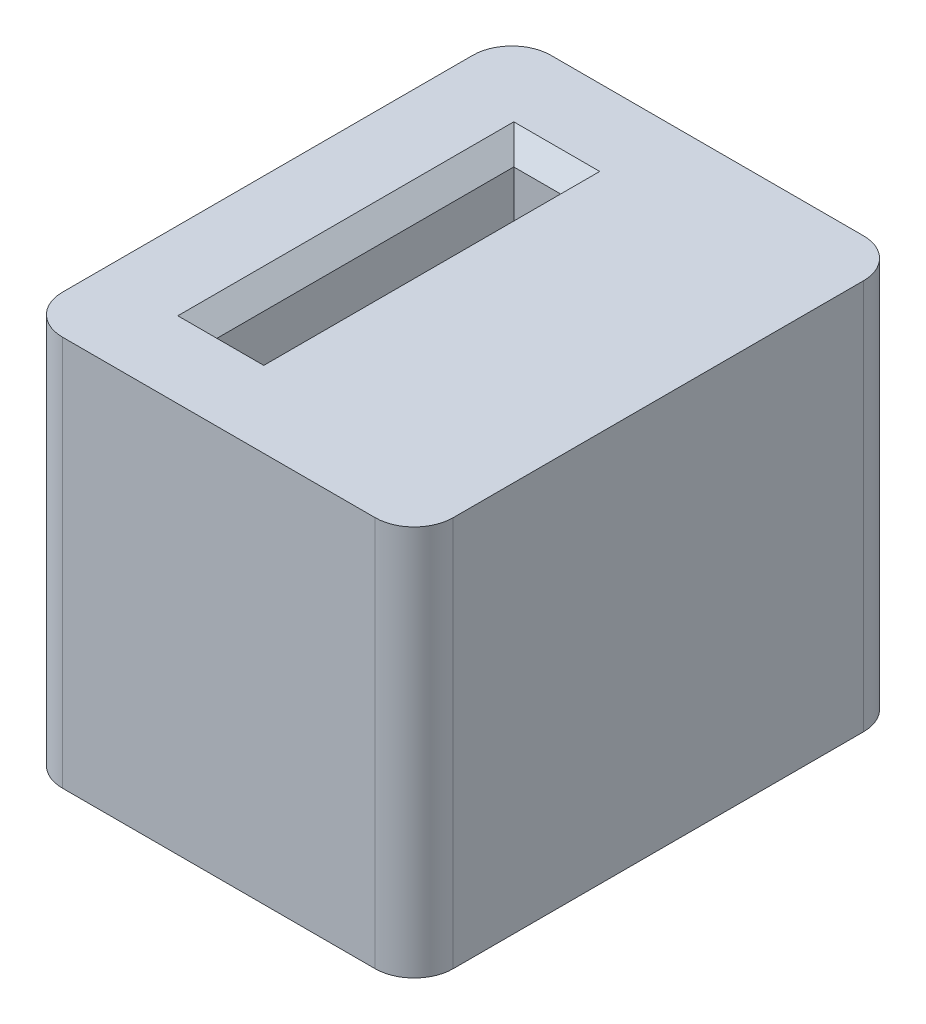
ISO-10303-21;
HEADER;
FILE_DESCRIPTION(('STEP AP214'),'2;1');
FILE_NAME('part.step','',(''),(''),'','','');
FILE_SCHEMA(('AUTOMOTIVE_DESIGN { 1 0 10303 214 1 1 1 1 }'));
ENDSEC;
DATA;
#1=APPLICATION_CONTEXT('core data for automotive mechanical design processes');
#2=APPLICATION_PROTOCOL_DEFINITION('international standard','automotive_design',2000,#1);
#3=PRODUCT_CONTEXT('',#1,'mechanical');
#4=PRODUCT('Part','Part','',(#3));
#5=PRODUCT_RELATED_PRODUCT_CATEGORY('part','',(#4));
#6=PRODUCT_DEFINITION_FORMATION('','',#4);
#7=PRODUCT_DEFINITION_CONTEXT('part definition',#1,'design');
#8=PRODUCT_DEFINITION('design','',#6,#7);
#9=PRODUCT_DEFINITION_SHAPE('','',#8);
#10=(LENGTH_UNIT() NAMED_UNIT(*) SI_UNIT(.MILLI.,.METRE.));
#11=(NAMED_UNIT(*) PLANE_ANGLE_UNIT() SI_UNIT($,.RADIAN.));
#12=(NAMED_UNIT(*) SI_UNIT($,.STERADIAN.) SOLID_ANGLE_UNIT());
#13=UNCERTAINTY_MEASURE_WITH_UNIT(LENGTH_MEASURE(1.E-05),#10,'distance_accuracy_value','');
#14=(GEOMETRIC_REPRESENTATION_CONTEXT(3) GLOBAL_UNCERTAINTY_ASSIGNED_CONTEXT((#13)) GLOBAL_UNIT_ASSIGNED_CONTEXT((#10,
#11,#12)) REPRESENTATION_CONTEXT('',''));
#15=CARTESIAN_POINT('',(0.,0.,0.));
#16=DIRECTION('',(0.,0.,1.));
#17=DIRECTION('',(1.,0.,0.));
#18=AXIS2_PLACEMENT_3D('',#15,#16,#17);
#19=CARTESIAN_POINT('',(12.7,25.4,-15.875));
#20=DIRECTION('',(-1.,0.,0.));
#21=DIRECTION('',(0.,0.,1.));
#22=AXIS2_PLACEMENT_3D('',#19,#20,#21);
#23=PLANE('',#22);
#24=DIRECTION('',(0.,0.,-1.));
#25=VECTOR('',#24,1.);
#26=CARTESIAN_POINT('',(12.7,0.,-15.875));
#27=LINE('',#26,#25);
#28=CARTESIAN_POINT('',(12.7,0.,13.335));
#29=VERTEX_POINT('',#28);
#30=CARTESIAN_POINT('',(12.7,0.,-13.335));
#31=VERTEX_POINT('',#30);
#32=EDGE_CURVE('E185',#29,#31,#27,.T.);
#33=ORIENTED_EDGE('',*,*,#32,.T.);
#34=DIRECTION('',(0.,-1.,0.));
#35=VECTOR('',#34,1.);
#36=CARTESIAN_POINT('',(12.7,25.4,-13.335));
#37=LINE('',#36,#35);
#38=CARTESIAN_POINT('',(12.7,25.4,-13.335));
#39=VERTEX_POINT('',#38);
#40=EDGE_CURVE('E160',#31,#39,#37,.F.);
#41=ORIENTED_EDGE('',*,*,#40,.T.);
#42=DIRECTION('',(0.,0.,-1.));
#43=VECTOR('',#42,1.);
#44=CARTESIAN_POINT('',(12.7,25.4,-15.875));
#45=LINE('',#44,#43);
#46=CARTESIAN_POINT('',(12.7,25.4,13.335));
#47=VERTEX_POINT('',#46);
#48=EDGE_CURVE('E199',#47,#39,#45,.T.);
#49=ORIENTED_EDGE('',*,*,#48,.F.);
#50=DIRECTION('',(0.,-1.,0.));
#51=VECTOR('',#50,1.);
#52=CARTESIAN_POINT('',(12.7,25.4,13.335));
#53=LINE('',#52,#51);
#54=EDGE_CURVE('E166',#47,#29,#53,.T.);
#55=ORIENTED_EDGE('',*,*,#54,.T.);
#56=EDGE_LOOP('',(#33,#41,#49,#55));
#57=FACE_BOUND('',#56,.T.);
#58=ADVANCED_FACE('F40',(#57),#23,.F.);
#59=CARTESIAN_POINT('',(-12.7,25.4,-15.875));
#60=DIRECTION('',(0.,0.,1.));
#61=DIRECTION('',(1.,0.,0.));
#62=AXIS2_PLACEMENT_3D('',#59,#60,#61);
#63=PLANE('',#62);
#64=DIRECTION('',(-1.,0.,0.));
#65=VECTOR('',#64,1.);
#66=CARTESIAN_POINT('',(-12.7,25.4,-15.875));
#67=LINE('',#66,#65);
#68=CARTESIAN_POINT('',(10.16,25.4,-15.875));
#69=VERTEX_POINT('',#68);
#70=CARTESIAN_POINT('',(-10.16,25.4,-15.875));
#71=VERTEX_POINT('',#70);
#72=EDGE_CURVE('E176',#69,#71,#67,.T.);
#73=ORIENTED_EDGE('',*,*,#72,.F.);
#74=DIRECTION('',(0.,-1.,0.));
#75=VECTOR('',#74,1.);
#76=CARTESIAN_POINT('',(10.16,25.4,-15.875));
#77=LINE('',#76,#75);
#78=CARTESIAN_POINT('',(10.16,0.,-15.875));
#79=VERTEX_POINT('',#78);
#80=EDGE_CURVE('E159',#69,#79,#77,.T.);
#81=ORIENTED_EDGE('',*,*,#80,.T.);
#82=DIRECTION('',(-1.,0.,0.));
#83=VECTOR('',#82,1.);
#84=CARTESIAN_POINT('',(-12.7,0.,-15.875));
#85=LINE('',#84,#83);
#86=CARTESIAN_POINT('',(-10.16,0.,-15.875));
#87=VERTEX_POINT('',#86);
#88=EDGE_CURVE('E173',#79,#87,#85,.T.);
#89=ORIENTED_EDGE('',*,*,#88,.T.);
#90=DIRECTION('',(0.,-1.,0.));
#91=VECTOR('',#90,1.);
#92=CARTESIAN_POINT('',(-10.16,25.4,-15.875));
#93=LINE('',#92,#91);
#94=EDGE_CURVE('E179',#87,#71,#93,.F.);
#95=ORIENTED_EDGE('',*,*,#94,.T.);
#96=EDGE_LOOP('',(#73,#81,#89,#95));
#97=FACE_BOUND('',#96,.T.);
#98=ADVANCED_FACE('F172',(#97),#63,.F.);
#99=CARTESIAN_POINT('',(-12.7,25.4,-15.875));
#100=DIRECTION('',(1.,0.,0.));
#101=DIRECTION('',(0.,0.,-1.));
#102=AXIS2_PLACEMENT_3D('',#99,#100,#101);
#103=PLANE('',#102);
#104=DIRECTION('',(0.,0.,1.));
#105=VECTOR('',#104,1.);
#106=CARTESIAN_POINT('',(-12.7,0.,-15.875));
#107=LINE('',#106,#105);
#108=CARTESIAN_POINT('',(-12.7,0.,-13.335));
#109=VERTEX_POINT('',#108);
#110=CARTESIAN_POINT('',(-12.7,0.,13.335));
#111=VERTEX_POINT('',#110);
#112=EDGE_CURVE('E184',#109,#111,#107,.T.);
#113=ORIENTED_EDGE('',*,*,#112,.T.);
#114=DIRECTION('',(0.,-1.,0.));
#115=VECTOR('',#114,1.);
#116=CARTESIAN_POINT('',(-12.7,25.4,13.335));
#117=LINE('',#116,#115);
#118=CARTESIAN_POINT('',(-12.7,25.4,13.335));
#119=VERTEX_POINT('',#118);
#120=EDGE_CURVE('E238',#111,#119,#117,.F.);
#121=ORIENTED_EDGE('',*,*,#120,.T.);
#122=DIRECTION('',(0.,0.,1.));
#123=VECTOR('',#122,1.);
#124=CARTESIAN_POINT('',(-12.7,25.4,-15.875));
#125=LINE('',#124,#123);
#126=CARTESIAN_POINT('',(-12.7,25.4,-13.335));
#127=VERTEX_POINT('',#126);
#128=EDGE_CURVE('E341',#127,#119,#125,.T.);
#129=ORIENTED_EDGE('',*,*,#128,.F.);
#130=DIRECTION('',(0.,-1.,0.));
#131=VECTOR('',#130,1.);
#132=CARTESIAN_POINT('',(-12.7,25.4,-13.335));
#133=LINE('',#132,#131);
#134=EDGE_CURVE('E234',#127,#109,#133,.T.);
#135=ORIENTED_EDGE('',*,*,#134,.T.);
#136=EDGE_LOOP('',(#113,#121,#129,#135));
#137=FACE_BOUND('',#136,.T.);
#138=ADVANCED_FACE('F361',(#137),#103,.F.);
#139=CARTESIAN_POINT('',(-12.7,25.4,15.875));
#140=DIRECTION('',(0.,0.,-1.));
#141=DIRECTION('',(-1.,0.,0.));
#142=AXIS2_PLACEMENT_3D('',#139,#140,#141);
#143=PLANE('',#142);
#144=DIRECTION('',(1.,0.,0.));
#145=VECTOR('',#144,1.);
#146=CARTESIAN_POINT('',(-12.7,25.4,15.875));
#147=LINE('',#146,#145);
#148=CARTESIAN_POINT('',(-10.16,25.4,15.875));
#149=VERTEX_POINT('',#148);
#150=CARTESIAN_POINT('',(10.16,25.4,15.875));
#151=VERTEX_POINT('',#150);
#152=EDGE_CURVE('E201',#149,#151,#147,.T.);
#153=ORIENTED_EDGE('',*,*,#152,.F.);
#154=DIRECTION('',(0.,-1.,0.));
#155=VECTOR('',#154,1.);
#156=CARTESIAN_POINT('',(-10.16,25.4,15.875));
#157=LINE('',#156,#155);
#158=CARTESIAN_POINT('',(-10.16,0.,15.875));
#159=VERTEX_POINT('',#158);
#160=EDGE_CURVE('E230',#149,#159,#157,.T.);
#161=ORIENTED_EDGE('',*,*,#160,.T.);
#162=DIRECTION('',(1.,0.,0.));
#163=VECTOR('',#162,1.);
#164=CARTESIAN_POINT('',(-12.7,0.,15.875));
#165=LINE('',#164,#163);
#166=CARTESIAN_POINT('',(10.16,0.,15.875));
#167=VERTEX_POINT('',#166);
#168=EDGE_CURVE('E190',#159,#167,#165,.T.);
#169=ORIENTED_EDGE('',*,*,#168,.T.);
#170=DIRECTION('',(0.,-1.,0.));
#171=VECTOR('',#170,1.);
#172=CARTESIAN_POINT('',(10.16,25.4,15.875));
#173=LINE('',#172,#171);
#174=EDGE_CURVE('E227',#167,#151,#173,.F.);
#175=ORIENTED_EDGE('',*,*,#174,.T.);
#176=EDGE_LOOP('',(#153,#161,#169,#175));
#177=FACE_BOUND('',#176,.T.);
#178=ADVANCED_FACE('F330',(#177),#143,.F.);
#179=CARTESIAN_POINT('',(0.,25.4,0.));
#180=DIRECTION('',(0.,1.,0.));
#181=DIRECTION('',(0.,0.,1.));
#182=AXIS2_PLACEMENT_3D('',#179,#180,#181);
#183=PLANE('',#182);
#184=DIRECTION('',(0.,0.,1.));
#185=VECTOR('',#184,1.);
#186=CARTESIAN_POINT('',(-2.03199999999999,25.4,9.652));
#187=LINE('',#186,#185);
#188=CARTESIAN_POINT('',(-2.03199999999999,25.4,-10.922));
#189=VERTEX_POINT('',#188);
#190=CARTESIAN_POINT('',(-2.03199999999999,25.4,10.922));
#191=VERTEX_POINT('',#190);
#192=EDGE_CURVE('E51',#189,#191,#187,.T.);
#193=ORIENTED_EDGE('',*,*,#192,.T.);
#194=DIRECTION('',(-1.,0.,0.));
#195=VECTOR('',#194,1.);
#196=CARTESIAN_POINT('',(-6.35,25.4,10.922));
#197=LINE('',#196,#195);
#198=CARTESIAN_POINT('',(-7.62,25.4,10.922));
#199=VERTEX_POINT('',#198);
#200=EDGE_CURVE('E11',#191,#199,#197,.T.);
#201=ORIENTED_EDGE('',*,*,#200,.T.);
#202=DIRECTION('',(0.,0.,-1.));
#203=VECTOR('',#202,1.);
#204=CARTESIAN_POINT('',(-7.62,25.4,-9.652));
#205=LINE('',#204,#203);
#206=CARTESIAN_POINT('',(-7.62,25.4,-10.922));
#207=VERTEX_POINT('',#206);
#208=EDGE_CURVE('E280',#199,#207,#205,.T.);
#209=ORIENTED_EDGE('',*,*,#208,.T.);
#210=DIRECTION('',(1.,0.,0.));
#211=VECTOR('',#210,1.);
#212=CARTESIAN_POINT('',(-3.302,25.4,-10.922));
#213=LINE('',#212,#211);
#214=EDGE_CURVE('E62',#207,#189,#213,.T.);
#215=ORIENTED_EDGE('',*,*,#214,.T.);
#216=EDGE_LOOP('',(#193,#201,#209,#215));
#217=FACE_BOUND('',#216,.T.);
#218=ORIENTED_EDGE('',*,*,#48,.T.);
#219=CARTESIAN_POINT('',(10.16,25.4,-13.335));
#220=DIRECTION('',(0.,1.,0.));
#221=DIRECTION('',(0.,0.,1.));
#222=AXIS2_PLACEMENT_3D('',#219,#220,#221);
#223=CIRCLE('',#222,2.54);
#224=EDGE_CURVE('E224',#39,#69,#223,.T.);
#225=ORIENTED_EDGE('',*,*,#224,.T.);
#226=ORIENTED_EDGE('',*,*,#72,.T.);
#227=CARTESIAN_POINT('',(-10.16,25.4,-13.335));
#228=DIRECTION('',(0.,1.,0.));
#229=DIRECTION('',(0.,0.,1.));
#230=AXIS2_PLACEMENT_3D('',#227,#228,#229);
#231=CIRCLE('',#230,2.54);
#232=EDGE_CURVE('E215',#71,#127,#231,.T.);
#233=ORIENTED_EDGE('',*,*,#232,.T.);
#234=ORIENTED_EDGE('',*,*,#128,.T.);
#235=CARTESIAN_POINT('',(-10.16,25.4,13.335));
#236=DIRECTION('',(0.,1.,0.));
#237=DIRECTION('',(0.,0.,1.));
#238=AXIS2_PLACEMENT_3D('',#235,#236,#237);
#239=CIRCLE('',#238,2.54);
#240=EDGE_CURVE('E221',#119,#149,#239,.T.);
#241=ORIENTED_EDGE('',*,*,#240,.T.);
#242=ORIENTED_EDGE('',*,*,#152,.T.);
#243=CARTESIAN_POINT('',(10.16,25.4,13.335));
#244=DIRECTION('',(0.,1.,0.));
#245=DIRECTION('',(0.,0.,1.));
#246=AXIS2_PLACEMENT_3D('',#243,#244,#245);
#247=CIRCLE('',#246,2.54);
#248=EDGE_CURVE('E218',#151,#47,#247,.T.);
#249=ORIENTED_EDGE('',*,*,#248,.T.);
#250=EDGE_LOOP('',(#218,#225,#226,#233,#234,#241,#242,#249));
#251=FACE_BOUND('',#250,.T.);
#252=ADVANCED_FACE('F327',(#217,#251),#183,.T.);
#253=CARTESIAN_POINT('',(0.,0.,0.));
#254=DIRECTION('',(0.,1.,0.));
#255=DIRECTION('',(0.,0.,1.));
#256=AXIS2_PLACEMENT_3D('',#253,#254,#255);
#257=PLANE('',#256);
#258=DIRECTION('',(0.,0.,1.));
#259=VECTOR('',#258,1.);
#260=CARTESIAN_POINT('',(-7.61999999999999,0.,0.));
#261=LINE('',#260,#259);
#262=CARTESIAN_POINT('',(-7.61999999999999,0.,-10.922));
#263=VERTEX_POINT('',#262);
#264=CARTESIAN_POINT('',(-7.61999999999999,0.,10.922));
#265=VERTEX_POINT('',#264);
#266=EDGE_CURVE('E241',#263,#265,#261,.T.);
#267=ORIENTED_EDGE('',*,*,#266,.T.);
#268=DIRECTION('',(1.,0.,0.));
#269=VECTOR('',#268,1.);
#270=CARTESIAN_POINT('',(0.,0.,10.922));
#271=LINE('',#270,#269);
#272=CARTESIAN_POINT('',(-2.032,0.,10.922));
#273=VERTEX_POINT('',#272);
#274=EDGE_CURVE('E250',#265,#273,#271,.T.);
#275=ORIENTED_EDGE('',*,*,#274,.T.);
#276=DIRECTION('',(0.,0.,-1.));
#277=VECTOR('',#276,1.);
#278=CARTESIAN_POINT('',(-2.032,0.,0.));
#279=LINE('',#278,#277);
#280=CARTESIAN_POINT('',(-2.032,0.,-10.922));
#281=VERTEX_POINT('',#280);
#282=EDGE_CURVE('E247',#273,#281,#279,.T.);
#283=ORIENTED_EDGE('',*,*,#282,.T.);
#284=DIRECTION('',(-1.,0.,0.));
#285=VECTOR('',#284,1.);
#286=CARTESIAN_POINT('',(0.,0.,-10.922));
#287=LINE('',#286,#285);
#288=EDGE_CURVE('E244',#281,#263,#287,.T.);
#289=ORIENTED_EDGE('',*,*,#288,.T.);
#290=EDGE_LOOP('',(#267,#275,#283,#289));
#291=FACE_BOUND('',#290,.T.);
#292=ORIENTED_EDGE('',*,*,#88,.F.);
#293=CARTESIAN_POINT('',(10.16,0.,-13.335));
#294=DIRECTION('',(0.,1.,0.));
#295=DIRECTION('',(0.,0.,1.));
#296=AXIS2_PLACEMENT_3D('',#293,#294,#295);
#297=CIRCLE('',#296,2.54);
#298=EDGE_CURVE('E155',#79,#31,#297,.F.);
#299=ORIENTED_EDGE('',*,*,#298,.T.);
#300=ORIENTED_EDGE('',*,*,#32,.F.);
#301=CARTESIAN_POINT('',(10.16,0.,13.335));
#302=DIRECTION('',(0.,1.,0.));
#303=DIRECTION('',(0.,0.,1.));
#304=AXIS2_PLACEMENT_3D('',#301,#302,#303);
#305=CIRCLE('',#304,2.54);
#306=EDGE_CURVE('E205',#29,#167,#305,.F.);
#307=ORIENTED_EDGE('',*,*,#306,.T.);
#308=ORIENTED_EDGE('',*,*,#168,.F.);
#309=CARTESIAN_POINT('',(-10.16,0.,13.335));
#310=DIRECTION('',(0.,1.,0.));
#311=DIRECTION('',(0.,0.,1.));
#312=AXIS2_PLACEMENT_3D('',#309,#310,#311);
#313=CIRCLE('',#312,2.54);
#314=EDGE_CURVE('E167',#159,#111,#313,.F.);
#315=ORIENTED_EDGE('',*,*,#314,.T.);
#316=ORIENTED_EDGE('',*,*,#112,.F.);
#317=CARTESIAN_POINT('',(-10.16,0.,-13.335));
#318=DIRECTION('',(0.,1.,0.));
#319=DIRECTION('',(0.,0.,1.));
#320=AXIS2_PLACEMENT_3D('',#317,#318,#319);
#321=CIRCLE('',#320,2.54);
#322=EDGE_CURVE('E178',#109,#87,#321,.F.);
#323=ORIENTED_EDGE('',*,*,#322,.T.);
#324=EDGE_LOOP('',(#292,#299,#300,#307,#308,#315,#316,#323));
#325=FACE_BOUND('',#324,.T.);
#326=ADVANCED_FACE('F181',(#291,#325),#257,.F.);
#327=CARTESIAN_POINT('',(-3.302,0.,-9.652));
#328=DIRECTION('',(1.,0.,0.));
#329=DIRECTION('',(0.,0.,-1.));
#330=AXIS2_PLACEMENT_3D('',#327,#328,#329);
#331=PLANE('',#330);
#332=DIRECTION('',(0.,1.,0.));
#333=VECTOR('',#332,1.);
#334=CARTESIAN_POINT('',(-3.302,0.,-9.652));
#335=LINE('',#334,#333);
#336=CARTESIAN_POINT('',(-3.302,1.27,-9.652));
#337=VERTEX_POINT('',#336);
#338=CARTESIAN_POINT('',(-3.302,24.13,-9.652));
#339=VERTEX_POINT('',#338);
#340=EDGE_CURVE('E301',#337,#339,#335,.T.);
#341=ORIENTED_EDGE('',*,*,#340,.F.);
#342=DIRECTION('',(0.,0.,1.));
#343=VECTOR('',#342,1.);
#344=CARTESIAN_POINT('',(-3.302,1.27,-9.652));
#345=LINE('',#344,#343);
#346=CARTESIAN_POINT('',(-3.302,1.27,9.652));
#347=VERTEX_POINT('',#346);
#348=EDGE_CURVE('E265',#337,#347,#345,.T.);
#349=ORIENTED_EDGE('',*,*,#348,.T.);
#350=DIRECTION('',(0.,1.,0.));
#351=VECTOR('',#350,1.);
#352=CARTESIAN_POINT('',(-3.302,0.,9.652));
#353=LINE('',#352,#351);
#354=CARTESIAN_POINT('',(-3.302,24.13,9.652));
#355=VERTEX_POINT('',#354);
#356=EDGE_CURVE('E192',#347,#355,#353,.T.);
#357=ORIENTED_EDGE('',*,*,#356,.T.);
#358=DIRECTION('',(0.,0.,-1.));
#359=VECTOR('',#358,1.);
#360=CARTESIAN_POINT('',(-3.302,24.13,-9.652));
#361=LINE('',#360,#359);
#362=EDGE_CURVE('E262',#355,#339,#361,.T.);
#363=ORIENTED_EDGE('',*,*,#362,.T.);
#364=EDGE_LOOP('',(#341,#349,#357,#363));
#365=FACE_BOUND('',#364,.T.);
#366=ADVANCED_FACE('F418',(#365),#331,.F.);
#367=CARTESIAN_POINT('',(-6.35,0.,9.652));
#368=DIRECTION('',(0.,0.,1.));
#369=DIRECTION('',(1.,0.,0.));
#370=AXIS2_PLACEMENT_3D('',#367,#368,#369);
#371=PLANE('',#370);
#372=ORIENTED_EDGE('',*,*,#356,.F.);
#373=DIRECTION('',(-1.,0.,0.));
#374=VECTOR('',#373,1.);
#375=CARTESIAN_POINT('',(-6.35,1.27,9.652));
#376=LINE('',#375,#374);
#377=CARTESIAN_POINT('',(-6.35,1.27,9.652));
#378=VERTEX_POINT('',#377);
#379=EDGE_CURVE('E258',#347,#378,#376,.T.);
#380=ORIENTED_EDGE('',*,*,#379,.T.);
#381=DIRECTION('',(0.,1.,0.));
#382=VECTOR('',#381,1.);
#383=CARTESIAN_POINT('',(-6.35,0.,9.652));
#384=LINE('',#383,#382);
#385=CARTESIAN_POINT('',(-6.35,24.13,9.652));
#386=VERTEX_POINT('',#385);
#387=EDGE_CURVE('E549',#378,#386,#384,.T.);
#388=ORIENTED_EDGE('',*,*,#387,.T.);
#389=DIRECTION('',(1.,0.,0.));
#390=VECTOR('',#389,1.);
#391=CARTESIAN_POINT('',(-3.302,24.13,9.652));
#392=LINE('',#391,#390);
#393=EDGE_CURVE('E254',#386,#355,#392,.T.);
#394=ORIENTED_EDGE('',*,*,#393,.T.);
#395=EDGE_LOOP('',(#372,#380,#388,#394));
#396=FACE_BOUND('',#395,.T.);
#397=ADVANCED_FACE('F426',(#396),#371,.F.);
#398=CARTESIAN_POINT('',(-6.35,0.,-9.652));
#399=DIRECTION('',(-1.,0.,0.));
#400=DIRECTION('',(0.,0.,1.));
#401=AXIS2_PLACEMENT_3D('',#398,#399,#400);
#402=PLANE('',#401);
#403=ORIENTED_EDGE('',*,*,#387,.F.);
#404=DIRECTION('',(0.,0.,-1.));
#405=VECTOR('',#404,1.);
#406=CARTESIAN_POINT('',(-6.35,1.27,-9.652));
#407=LINE('',#406,#405);
#408=CARTESIAN_POINT('',(-6.35,1.27,-9.652));
#409=VERTEX_POINT('',#408);
#410=EDGE_CURVE('E277',#378,#409,#407,.T.);
#411=ORIENTED_EDGE('',*,*,#410,.T.);
#412=DIRECTION('',(0.,1.,0.));
#413=VECTOR('',#412,1.);
#414=CARTESIAN_POINT('',(-6.35,0.,-9.652));
#415=LINE('',#414,#413);
#416=CARTESIAN_POINT('',(-6.35,24.13,-9.652));
#417=VERTEX_POINT('',#416);
#418=EDGE_CURVE('E552',#409,#417,#415,.T.);
#419=ORIENTED_EDGE('',*,*,#418,.T.);
#420=DIRECTION('',(0.,0.,1.));
#421=VECTOR('',#420,1.);
#422=CARTESIAN_POINT('',(-6.35,24.13,9.652));
#423=LINE('',#422,#421);
#424=EDGE_CURVE('E274',#417,#386,#423,.T.);
#425=ORIENTED_EDGE('',*,*,#424,.T.);
#426=EDGE_LOOP('',(#403,#411,#419,#425));
#427=FACE_BOUND('',#426,.T.);
#428=ADVANCED_FACE('F434',(#427),#402,.F.);
#429=CARTESIAN_POINT('',(-6.35,0.,-9.652));
#430=DIRECTION('',(0.,0.,-1.));
#431=DIRECTION('',(-1.,0.,0.));
#432=AXIS2_PLACEMENT_3D('',#429,#430,#431);
#433=PLANE('',#432);
#434=ORIENTED_EDGE('',*,*,#418,.F.);
#435=DIRECTION('',(1.,0.,0.));
#436=VECTOR('',#435,1.);
#437=CARTESIAN_POINT('',(-6.35,1.27,-9.652));
#438=LINE('',#437,#436);
#439=EDGE_CURVE('E271',#409,#337,#438,.T.);
#440=ORIENTED_EDGE('',*,*,#439,.T.);
#441=ORIENTED_EDGE('',*,*,#340,.T.);
#442=DIRECTION('',(-1.,0.,0.));
#443=VECTOR('',#442,1.);
#444=CARTESIAN_POINT('',(-6.35,24.13,-9.652));
#445=LINE('',#444,#443);
#446=EDGE_CURVE('E268',#339,#417,#445,.T.);
#447=ORIENTED_EDGE('',*,*,#446,.T.);
#448=EDGE_LOOP('',(#434,#440,#441,#447));
#449=FACE_BOUND('',#448,.T.);
#450=ADVANCED_FACE('F389',(#449),#433,.F.);
#451=CARTESIAN_POINT('',(10.16,25.4,-13.335));
#452=DIRECTION('',(0.,-1.,0.));
#453=DIRECTION('',(0.,0.,-1.));
#454=AXIS2_PLACEMENT_3D('',#451,#452,#453);
#455=CYLINDRICAL_SURFACE('',#454,2.54);
#456=ORIENTED_EDGE('',*,*,#224,.F.);
#457=ORIENTED_EDGE('',*,*,#40,.F.);
#458=ORIENTED_EDGE('',*,*,#298,.F.);
#459=ORIENTED_EDGE('',*,*,#80,.F.);
#460=EDGE_LOOP('',(#456,#457,#458,#459));
#461=FACE_BOUND('',#460,.T.);
#462=ADVANCED_FACE('F158',(#461),#455,.T.);
#463=CARTESIAN_POINT('',(-10.16,25.4,13.335));
#464=DIRECTION('',(0.,-1.,0.));
#465=DIRECTION('',(0.,0.,-1.));
#466=AXIS2_PLACEMENT_3D('',#463,#464,#465);
#467=CYLINDRICAL_SURFACE('',#466,2.54);
#468=ORIENTED_EDGE('',*,*,#240,.F.);
#469=ORIENTED_EDGE('',*,*,#120,.F.);
#470=ORIENTED_EDGE('',*,*,#314,.F.);
#471=ORIENTED_EDGE('',*,*,#160,.F.);
#472=EDGE_LOOP('',(#468,#469,#470,#471));
#473=FACE_BOUND('',#472,.T.);
#474=ADVANCED_FACE('F358',(#473),#467,.T.);
#475=CARTESIAN_POINT('',(10.16,25.4,13.335));
#476=DIRECTION('',(0.,-1.,0.));
#477=DIRECTION('',(0.,0.,-1.));
#478=AXIS2_PLACEMENT_3D('',#475,#476,#477);
#479=CYLINDRICAL_SURFACE('',#478,2.54);
#480=ORIENTED_EDGE('',*,*,#248,.F.);
#481=ORIENTED_EDGE('',*,*,#174,.F.);
#482=ORIENTED_EDGE('',*,*,#306,.F.);
#483=ORIENTED_EDGE('',*,*,#54,.F.);
#484=EDGE_LOOP('',(#480,#481,#482,#483));
#485=FACE_BOUND('',#484,.T.);
#486=ADVANCED_FACE('F355',(#485),#479,.T.);
#487=CARTESIAN_POINT('',(-10.16,25.4,-13.335));
#488=DIRECTION('',(0.,-1.,0.));
#489=DIRECTION('',(0.,0.,-1.));
#490=AXIS2_PLACEMENT_3D('',#487,#488,#489);
#491=CYLINDRICAL_SURFACE('',#490,2.54);
#492=ORIENTED_EDGE('',*,*,#232,.F.);
#493=ORIENTED_EDGE('',*,*,#94,.F.);
#494=ORIENTED_EDGE('',*,*,#322,.F.);
#495=ORIENTED_EDGE('',*,*,#134,.F.);
#496=EDGE_LOOP('',(#492,#493,#494,#495));
#497=FACE_BOUND('',#496,.T.);
#498=ADVANCED_FACE('F366',(#497),#491,.T.);
#499=CARTESIAN_POINT('',(0.,0.,-10.922));
#500=DIRECTION('',(0.,0.707106781186546,-0.707106781186549));
#501=DIRECTION('',(-1.,0.,0.));
#502=AXIS2_PLACEMENT_3D('',#499,#500,#501);
#503=PLANE('',#502);
#504=DIRECTION('',(-0.577350269189625,0.577350269189628,0.577350269189625));
#505=VECTOR('',#504,1.);
#506=CARTESIAN_POINT('',(-5.67266666666666,3.64066666666667,-7.28133333333334));
#507=LINE('',#506,#505);
#508=EDGE_CURVE('E293',#337,#281,#507,.F.);
#509=ORIENTED_EDGE('',*,*,#508,.F.);
#510=ORIENTED_EDGE('',*,*,#439,.F.);
#511=DIRECTION('',(0.577350269189625,0.577350269189628,0.577350269189625));
#512=VECTOR('',#511,1.);
#513=CARTESIAN_POINT('',(-5.08,2.54,-8.38200000000001));
#514=LINE('',#513,#512);
#515=EDGE_CURVE('E297',#263,#409,#514,.T.);
#516=ORIENTED_EDGE('',*,*,#515,.F.);
#517=ORIENTED_EDGE('',*,*,#288,.F.);
#518=EDGE_LOOP('',(#509,#510,#516,#517));
#519=FACE_BOUND('',#518,.T.);
#520=ADVANCED_FACE('F368',(#519),#503,.F.);
#521=CARTESIAN_POINT('',(-7.61999999999999,0.,0.));
#522=DIRECTION('',(-0.70710678118655,0.707106781186545,0.));
#523=DIRECTION('',(0.,0.,1.));
#524=AXIS2_PLACEMENT_3D('',#521,#522,#523);
#525=PLANE('',#524);
#526=ORIENTED_EDGE('',*,*,#515,.T.);
#527=ORIENTED_EDGE('',*,*,#410,.F.);
#528=DIRECTION('',(-0.577350269189625,-0.577350269189628,0.577350269189625));
#529=VECTOR('',#528,1.);
#530=CARTESIAN_POINT('',(-5.08,2.54,8.382));
#531=LINE('',#530,#529);
#532=EDGE_CURVE('E290',#265,#378,#531,.F.);
#533=ORIENTED_EDGE('',*,*,#532,.F.);
#534=ORIENTED_EDGE('',*,*,#266,.F.);
#535=EDGE_LOOP('',(#526,#527,#533,#534));
#536=FACE_BOUND('',#535,.T.);
#537=ADVANCED_FACE('F374',(#536),#525,.F.);
#538=CARTESIAN_POINT('',(-2.032,0.,0.));
#539=DIRECTION('',(0.707106781186549,0.707106781186546,0.));
#540=DIRECTION('',(0.,0.,-1.));
#541=AXIS2_PLACEMENT_3D('',#538,#539,#540);
#542=PLANE('',#541);
#543=ORIENTED_EDGE('',*,*,#508,.T.);
#544=ORIENTED_EDGE('',*,*,#282,.F.);
#545=DIRECTION('',(-0.577350269189625,0.577350269189628,-0.577350269189625));
#546=VECTOR('',#545,1.);
#547=CARTESIAN_POINT('',(-1.35466666666667,-0.677333333333335,11.5993333333333));
#548=LINE('',#547,#546);
#549=EDGE_CURVE('E287',#347,#273,#548,.F.);
#550=ORIENTED_EDGE('',*,*,#549,.F.);
#551=ORIENTED_EDGE('',*,*,#348,.F.);
#552=EDGE_LOOP('',(#543,#544,#550,#551));
#553=FACE_BOUND('',#552,.T.);
#554=ADVANCED_FACE('F461',(#553),#542,.F.);
#555=CARTESIAN_POINT('',(0.,0.,10.922));
#556=DIRECTION('',(0.,0.707106781186546,0.707106781186549));
#557=DIRECTION('',(1.,0.,0.));
#558=AXIS2_PLACEMENT_3D('',#555,#556,#557);
#559=PLANE('',#558);
#560=ORIENTED_EDGE('',*,*,#532,.T.);
#561=ORIENTED_EDGE('',*,*,#379,.F.);
#562=ORIENTED_EDGE('',*,*,#549,.T.);
#563=ORIENTED_EDGE('',*,*,#274,.F.);
#564=EDGE_LOOP('',(#560,#561,#562,#563));
#565=FACE_BOUND('',#564,.T.);
#566=ADVANCED_FACE('F471',(#565),#559,.F.);
#567=CARTESIAN_POINT('',(-6.35,24.13,-9.652));
#568=DIRECTION('',(0.,0.70710678118655,0.707106781186546));
#569=DIRECTION('',(1.,0.,0.));
#570=AXIS2_PLACEMENT_3D('',#567,#568,#569);
#571=PLANE('',#570);
#572=DIRECTION('',(0.577350269189627,0.577350269189624,-0.577350269189627));
#573=VECTOR('',#572,1.);
#574=CARTESIAN_POINT('',(-3.302,24.13,-9.652));
#575=LINE('',#574,#573);
#576=EDGE_CURVE('E307',#189,#339,#575,.F.);
#577=ORIENTED_EDGE('',*,*,#576,.F.);
#578=ORIENTED_EDGE('',*,*,#214,.F.);
#579=DIRECTION('',(-0.577350269189627,0.577350269189624,-0.577350269189627));
#580=VECTOR('',#579,1.);
#581=CARTESIAN_POINT('',(-6.35,24.13,-9.652));
#582=LINE('',#581,#580);
#583=EDGE_CURVE('E45',#417,#207,#582,.T.);
#584=ORIENTED_EDGE('',*,*,#583,.F.);
#585=ORIENTED_EDGE('',*,*,#446,.F.);
#586=EDGE_LOOP('',(#577,#578,#584,#585));
#587=FACE_BOUND('',#586,.T.);
#588=ADVANCED_FACE('F43',(#587),#571,.T.);
#589=CARTESIAN_POINT('',(-6.35,24.13,-9.652));
#590=DIRECTION('',(0.707106781186546,0.707106781186549,0.));
#591=DIRECTION('',(0.,0.,-1.));
#592=AXIS2_PLACEMENT_3D('',#589,#590,#591);
#593=PLANE('',#592);
#594=ORIENTED_EDGE('',*,*,#583,.T.);
#595=ORIENTED_EDGE('',*,*,#208,.F.);
#596=DIRECTION('',(0.577350269189627,-0.577350269189624,-0.577350269189627));
#597=VECTOR('',#596,1.);
#598=CARTESIAN_POINT('',(-6.35,24.13,9.652));
#599=LINE('',#598,#597);
#600=EDGE_CURVE('E305',#386,#199,#599,.F.);
#601=ORIENTED_EDGE('',*,*,#600,.F.);
#602=ORIENTED_EDGE('',*,*,#424,.F.);
#603=EDGE_LOOP('',(#594,#595,#601,#602));
#604=FACE_BOUND('',#603,.T.);
#605=ADVANCED_FACE('F318',(#604),#593,.T.);
#606=CARTESIAN_POINT('',(-3.302,24.13,-9.652));
#607=DIRECTION('',(-0.707106781186546,0.70710678118655,0.));
#608=DIRECTION('',(0.,0.,1.));
#609=AXIS2_PLACEMENT_3D('',#606,#607,#608);
#610=PLANE('',#609);
#611=ORIENTED_EDGE('',*,*,#576,.T.);
#612=ORIENTED_EDGE('',*,*,#362,.F.);
#613=DIRECTION('',(0.577350269189627,0.577350269189624,0.577350269189627));
#614=VECTOR('',#613,1.);
#615=CARTESIAN_POINT('',(-4.318,23.114,8.63599999999999));
#616=LINE('',#615,#614);
#617=EDGE_CURVE('E302',#191,#355,#616,.F.);
#618=ORIENTED_EDGE('',*,*,#617,.F.);
#619=ORIENTED_EDGE('',*,*,#192,.F.);
#620=EDGE_LOOP('',(#611,#612,#618,#619));
#621=FACE_BOUND('',#620,.T.);
#622=ADVANCED_FACE('F323',(#621),#610,.T.);
#623=CARTESIAN_POINT('',(-6.35,24.13,9.652));
#624=DIRECTION('',(0.,0.70710678118655,-0.707106781186546));
#625=DIRECTION('',(-1.,0.,0.));
#626=AXIS2_PLACEMENT_3D('',#623,#624,#625);
#627=PLANE('',#626);
#628=ORIENTED_EDGE('',*,*,#600,.T.);
#629=ORIENTED_EDGE('',*,*,#200,.F.);
#630=ORIENTED_EDGE('',*,*,#617,.T.);
#631=ORIENTED_EDGE('',*,*,#393,.F.);
#632=EDGE_LOOP('',(#628,#629,#630,#631));
#633=FACE_BOUND('',#632,.T.);
#634=ADVANCED_FACE('F326',(#633),#627,.T.);
#635=CLOSED_SHELL('',(#58,#98,#138,#178,#252,#326,#366,#397,#428,#450,#462,#474,#486,#498,#520,
#537,#554,#566,#588,#605,#622,#634));
#636=MANIFOLD_SOLID_BREP('B2',#635);
#637=ADVANCED_BREP_SHAPE_REPRESENTATION('',(#18,#636),#14);
#638=SHAPE_DEFINITION_REPRESENTATION(#9,#637);
ENDSEC;
END-ISO-10303-21;
